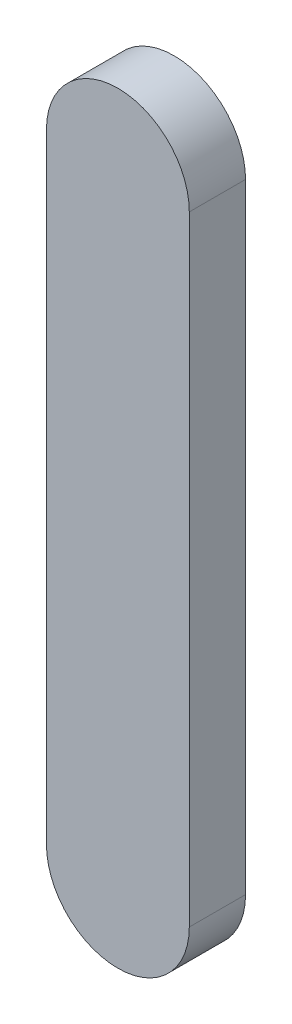
ISO-10303-21;
HEADER;
FILE_DESCRIPTION(('STEP AP214'),'2;1');
FILE_NAME('part.step','',(''),(''),'','','');
FILE_SCHEMA(('AUTOMOTIVE_DESIGN { 1 0 10303 214 1 1 1 1 }'));
ENDSEC;
DATA;
#1=APPLICATION_CONTEXT('core data for automotive mechanical design processes');
#2=APPLICATION_PROTOCOL_DEFINITION('international standard','automotive_design',2000,#1);
#3=PRODUCT_CONTEXT('',#1,'mechanical');
#4=PRODUCT('Part','Part','',(#3));
#5=PRODUCT_RELATED_PRODUCT_CATEGORY('part','',(#4));
#6=PRODUCT_DEFINITION_FORMATION('','',#4);
#7=PRODUCT_DEFINITION_CONTEXT('part definition',#1,'design');
#8=PRODUCT_DEFINITION('design','',#6,#7);
#9=PRODUCT_DEFINITION_SHAPE('','',#8);
#10=(LENGTH_UNIT() NAMED_UNIT(*) SI_UNIT(.MILLI.,.METRE.));
#11=(NAMED_UNIT(*) PLANE_ANGLE_UNIT() SI_UNIT($,.RADIAN.));
#12=(NAMED_UNIT(*) SI_UNIT($,.STERADIAN.) SOLID_ANGLE_UNIT());
#13=UNCERTAINTY_MEASURE_WITH_UNIT(LENGTH_MEASURE(1.E-05),#10,'distance_accuracy_value','');
#14=(GEOMETRIC_REPRESENTATION_CONTEXT(3) GLOBAL_UNCERTAINTY_ASSIGNED_CONTEXT((#13)) GLOBAL_UNIT_ASSIGNED_CONTEXT((#10,
#11,#12)) REPRESENTATION_CONTEXT('',''));
#15=CARTESIAN_POINT('',(0.,0.,0.));
#16=DIRECTION('',(0.,0.,1.));
#17=DIRECTION('',(1.,0.,0.));
#18=AXIS2_PLACEMENT_3D('',#15,#16,#17);
#19=CARTESIAN_POINT('',(133.5532,107.442,0.));
#20=DIRECTION('',(-1.,0.,0.));
#21=DIRECTION('',(0.,1.,0.));
#22=AXIS2_PLACEMENT_3D('',#19,#20,#21);
#23=PLANE('',#22);
#24=DIRECTION('',(0.,1.,0.));
#25=VECTOR('',#24,1.);
#26=CARTESIAN_POINT('',(133.5532,107.442,0.1999996));
#27=LINE('',#26,#25);
#28=CARTESIAN_POINT('',(133.5532,107.442,0.1999996));
#29=VERTEX_POINT('',#28);
#30=CARTESIAN_POINT('',(133.5532,109.6445356,0.1999996));
#31=VERTEX_POINT('',#30);
#32=EDGE_CURVE('E11',#29,#31,#27,.T.);
#33=ORIENTED_EDGE('',*,*,#32,.F.);
#34=DIRECTION('',(0.,0.,1.));
#35=VECTOR('',#34,1.);
#36=CARTESIAN_POINT('',(133.5532,107.442,0.));
#37=LINE('',#36,#35);
#38=CARTESIAN_POINT('',(133.5532,107.442,0.));
#39=VERTEX_POINT('',#38);
#40=EDGE_CURVE('E24',#39,#29,#37,.T.);
#41=ORIENTED_EDGE('',*,*,#40,.F.);
#42=DIRECTION('',(0.,1.,0.));
#43=VECTOR('',#42,1.);
#44=CARTESIAN_POINT('',(133.5532,107.442,0.));
#45=LINE('',#44,#43);
#46=CARTESIAN_POINT('',(133.5532,109.6445356,0.));
#47=VERTEX_POINT('',#46);
#48=EDGE_CURVE('E75',#39,#47,#45,.T.);
#49=ORIENTED_EDGE('',*,*,#48,.T.);
#50=DIRECTION('',(0.,0.,1.));
#51=VECTOR('',#50,1.);
#52=CARTESIAN_POINT('',(133.5532,109.6445356,0.));
#53=LINE('',#52,#51);
#54=EDGE_CURVE('E37',#47,#31,#53,.T.);
#55=ORIENTED_EDGE('',*,*,#54,.T.);
#56=EDGE_LOOP('',(#33,#41,#49,#55));
#57=FACE_BOUND('',#56,.T.);
#58=ADVANCED_FACE('F17',(#57),#23,.F.);
#59=CARTESIAN_POINT('',(133.2992,109.6445356,0.));
#60=DIRECTION('',(0.,0.,-1.));
#61=DIRECTION('',(1.,0.,0.));
#62=AXIS2_PLACEMENT_3D('',#59,#60,#61);
#63=CYLINDRICAL_SURFACE('',#62,0.254000000000005);
#64=CARTESIAN_POINT('',(133.2992,109.6445356,0.1999996));
#65=DIRECTION('',(0.,0.,1.));
#66=DIRECTION('',(1.,0.,0.));
#67=AXIS2_PLACEMENT_3D('',#64,#65,#66);
#68=CIRCLE('',#67,0.254000000000005);
#69=CARTESIAN_POINT('',(133.0452,109.6445356,0.1999996));
#70=VERTEX_POINT('',#69);
#71=EDGE_CURVE('E83',#31,#70,#68,.T.);
#72=ORIENTED_EDGE('',*,*,#71,.F.);
#73=ORIENTED_EDGE('',*,*,#54,.F.);
#74=CARTESIAN_POINT('',(133.2992,109.6445356,0.));
#75=DIRECTION('',(0.,0.,1.));
#76=DIRECTION('',(1.,0.,0.));
#77=AXIS2_PLACEMENT_3D('',#74,#75,#76);
#78=CIRCLE('',#77,0.254000000000005);
#79=CARTESIAN_POINT('',(133.0452,109.6445356,0.));
#80=VERTEX_POINT('',#79);
#81=EDGE_CURVE('E81',#47,#80,#78,.T.);
#82=ORIENTED_EDGE('',*,*,#81,.T.);
#83=DIRECTION('',(0.,0.,1.));
#84=VECTOR('',#83,1.);
#85=CARTESIAN_POINT('',(133.0452,109.6445356,0.));
#86=LINE('',#85,#84);
#87=EDGE_CURVE('E67',#80,#70,#86,.T.);
#88=ORIENTED_EDGE('',*,*,#87,.T.);
#89=EDGE_LOOP('',(#72,#73,#82,#88));
#90=FACE_BOUND('',#89,.T.);
#91=ADVANCED_FACE('F89',(#90),#63,.T.);
#92=CARTESIAN_POINT('',(133.0452,109.6445356,0.));
#93=DIRECTION('',(1.,0.,0.));
#94=DIRECTION('',(0.,-1.,0.));
#95=AXIS2_PLACEMENT_3D('',#92,#93,#94);
#96=PLANE('',#95);
#97=DIRECTION('',(0.,-1.,0.));
#98=VECTOR('',#97,1.);
#99=CARTESIAN_POINT('',(133.0452,109.6445356,0.1999996));
#100=LINE('',#99,#98);
#101=CARTESIAN_POINT('',(133.0452,107.442,0.1999996));
#102=VERTEX_POINT('',#101);
#103=EDGE_CURVE('E71',#70,#102,#100,.T.);
#104=ORIENTED_EDGE('',*,*,#103,.F.);
#105=ORIENTED_EDGE('',*,*,#87,.F.);
#106=DIRECTION('',(0.,-1.,0.));
#107=VECTOR('',#106,1.);
#108=CARTESIAN_POINT('',(133.0452,109.6445356,0.));
#109=LINE('',#108,#107);
#110=CARTESIAN_POINT('',(133.0452,107.442,0.));
#111=VERTEX_POINT('',#110);
#112=EDGE_CURVE('E63',#80,#111,#109,.T.);
#113=ORIENTED_EDGE('',*,*,#112,.T.);
#114=DIRECTION('',(0.,0.,1.));
#115=VECTOR('',#114,1.);
#116=CARTESIAN_POINT('',(133.0452,107.442,0.));
#117=LINE('',#116,#115);
#118=EDGE_CURVE('E53',#111,#102,#117,.T.);
#119=ORIENTED_EDGE('',*,*,#118,.T.);
#120=EDGE_LOOP('',(#104,#105,#113,#119));
#121=FACE_BOUND('',#120,.T.);
#122=ADVANCED_FACE('F66',(#121),#96,.F.);
#123=CARTESIAN_POINT('',(133.2992,107.442,0.));
#124=DIRECTION('',(0.,0.,-1.));
#125=DIRECTION('',(-1.,0.,0.));
#126=AXIS2_PLACEMENT_3D('',#123,#124,#125);
#127=CYLINDRICAL_SURFACE('',#126,0.254000000000005);
#128=CARTESIAN_POINT('',(133.2992,107.442,0.1999996));
#129=DIRECTION('',(0.,0.,1.));
#130=DIRECTION('',(-1.,0.,0.));
#131=AXIS2_PLACEMENT_3D('',#128,#129,#130);
#132=CIRCLE('',#131,0.254000000000005);
#133=EDGE_CURVE('E59',#102,#29,#132,.T.);
#134=ORIENTED_EDGE('',*,*,#133,.F.);
#135=ORIENTED_EDGE('',*,*,#118,.F.);
#136=CARTESIAN_POINT('',(133.2992,107.442,0.));
#137=DIRECTION('',(0.,0.,1.));
#138=DIRECTION('',(-1.,0.,0.));
#139=AXIS2_PLACEMENT_3D('',#136,#137,#138);
#140=CIRCLE('',#139,0.254000000000005);
#141=EDGE_CURVE('E57',#111,#39,#140,.T.);
#142=ORIENTED_EDGE('',*,*,#141,.T.);
#143=ORIENTED_EDGE('',*,*,#40,.T.);
#144=EDGE_LOOP('',(#134,#135,#142,#143));
#145=FACE_BOUND('',#144,.T.);
#146=ADVANCED_FACE('F55',(#145),#127,.T.);
#147=CARTESIAN_POINT('',(133.5532,107.442,0.));
#148=DIRECTION('',(0.,0.,-1.));
#149=DIRECTION('',(-1.,0.,0.));
#150=AXIS2_PLACEMENT_3D('',#147,#148,#149);
#151=PLANE('',#150);
#152=ORIENTED_EDGE('',*,*,#141,.F.);
#153=ORIENTED_EDGE('',*,*,#112,.F.);
#154=ORIENTED_EDGE('',*,*,#81,.F.);
#155=ORIENTED_EDGE('',*,*,#48,.F.);
#156=EDGE_LOOP('',(#152,#153,#154,#155));
#157=FACE_BOUND('',#156,.T.);
#158=ADVANCED_FACE('F74',(#157),#151,.T.);
#159=CARTESIAN_POINT('',(133.5532,107.442,0.1999996));
#160=DIRECTION('',(0.,0.,-1.));
#161=DIRECTION('',(-1.,0.,0.));
#162=AXIS2_PLACEMENT_3D('',#159,#160,#161);
#163=PLANE('',#162);
#164=ORIENTED_EDGE('',*,*,#32,.T.);
#165=ORIENTED_EDGE('',*,*,#71,.T.);
#166=ORIENTED_EDGE('',*,*,#103,.T.);
#167=ORIENTED_EDGE('',*,*,#133,.T.);
#168=EDGE_LOOP('',(#164,#165,#166,#167));
#169=FACE_BOUND('',#168,.T.);
#170=ADVANCED_FACE('F91',(#169),#163,.F.);
#171=CLOSED_SHELL('',(#58,#91,#122,#146,#158,#170));
#172=MANIFOLD_SOLID_BREP('B1',#171);
#173=ADVANCED_BREP_SHAPE_REPRESENTATION('',(#18,#172),#14);
#174=SHAPE_DEFINITION_REPRESENTATION(#9,#173);
ENDSEC;
END-ISO-10303-21;
